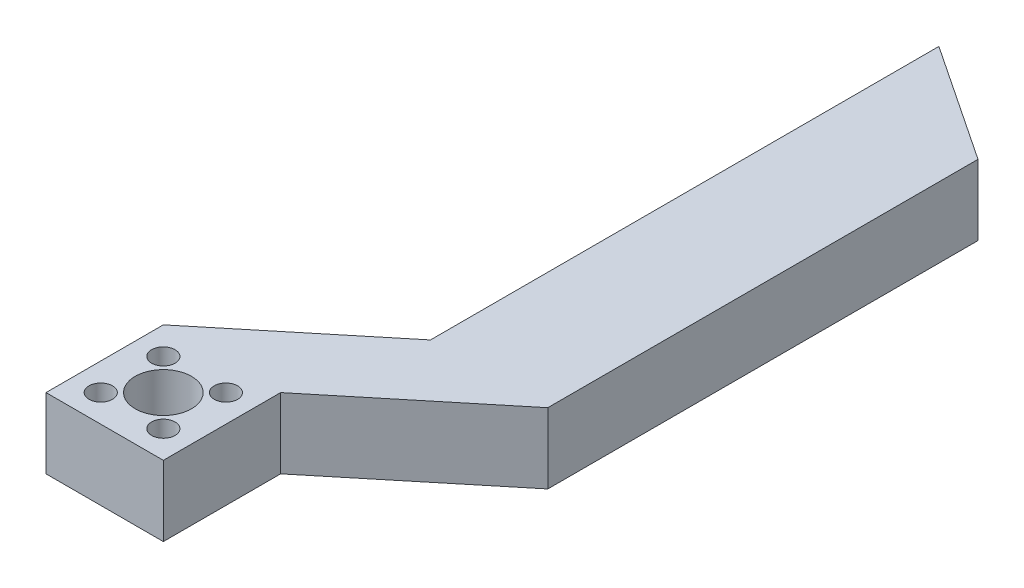
ISO-10303-21;
HEADER;
FILE_DESCRIPTION(('STEP AP214'),'2;1');
FILE_NAME('part.step','',(''),(''),'','','');
FILE_SCHEMA(('AUTOMOTIVE_DESIGN { 1 0 10303 214 1 1 1 1 }'));
ENDSEC;
DATA;
#1=APPLICATION_CONTEXT('core data for automotive mechanical design processes');
#2=APPLICATION_PROTOCOL_DEFINITION('international standard','automotive_design',2000,#1);
#3=PRODUCT_CONTEXT('',#1,'mechanical');
#4=PRODUCT('Part','Part','',(#3));
#5=PRODUCT_RELATED_PRODUCT_CATEGORY('part','',(#4));
#6=PRODUCT_DEFINITION_FORMATION('','',#4);
#7=PRODUCT_DEFINITION_CONTEXT('part definition',#1,'design');
#8=PRODUCT_DEFINITION('design','',#6,#7);
#9=PRODUCT_DEFINITION_SHAPE('','',#8);
#10=(LENGTH_UNIT() NAMED_UNIT(*) SI_UNIT(.MILLI.,.METRE.));
#11=(NAMED_UNIT(*) PLANE_ANGLE_UNIT() SI_UNIT($,.RADIAN.));
#12=(NAMED_UNIT(*) SI_UNIT($,.STERADIAN.) SOLID_ANGLE_UNIT());
#13=UNCERTAINTY_MEASURE_WITH_UNIT(LENGTH_MEASURE(1.E-05),#10,'distance_accuracy_value','');
#14=(GEOMETRIC_REPRESENTATION_CONTEXT(3) GLOBAL_UNCERTAINTY_ASSIGNED_CONTEXT((#13)) GLOBAL_UNIT_ASSIGNED_CONTEXT((#10,
#11,#12)) REPRESENTATION_CONTEXT('',''));
#15=CARTESIAN_POINT('',(0.,0.,0.));
#16=DIRECTION('',(0.,0.,1.));
#17=DIRECTION('',(1.,0.,0.));
#18=AXIS2_PLACEMENT_3D('',#15,#16,#17);
#19=CARTESIAN_POINT('',(0.,9.,0.));
#20=DIRECTION('',(0.,-1.,0.));
#21=DIRECTION('',(0.,0.,-1.));
#22=AXIS2_PLACEMENT_3D('',#19,#20,#21);
#23=PLANE('',#22);
#24=DIRECTION('',(0.772675976397421,0.,-0.634800626573645));
#25=VECTOR('',#24,1.);
#26=CARTESIAN_POINT('',(22.75,9.,-7.5));
#27=LINE('',#26,#25);
#28=CARTESIAN_POINT('',(22.75,9.,-7.5));
#29=VERTEX_POINT('',#28);
#30=CARTESIAN_POINT('',(41.5,9.,-22.9042730870849));
#31=VERTEX_POINT('',#30);
#32=EDGE_CURVE('E169',#29,#31,#27,.T.);
#33=ORIENTED_EDGE('',*,*,#32,.T.);
#34=DIRECTION('',(0.,0.,-1.));
#35=VECTOR('',#34,1.);
#36=CARTESIAN_POINT('',(41.5,9.,-77.9042730870849));
#37=LINE('',#36,#35);
#38=CARTESIAN_POINT('',(41.5,9.,-77.9042730870849));
#39=VERTEX_POINT('',#38);
#40=EDGE_CURVE('E104',#31,#39,#37,.T.);
#41=ORIENTED_EDGE('',*,*,#40,.T.);
#42=DIRECTION('',(-0.832050294337844,0.,-0.554700196225228));
#43=VECTOR('',#42,1.);
#44=CARTESIAN_POINT('',(26.5,9.,-87.9042730870849));
#45=LINE('',#44,#43);
#46=CARTESIAN_POINT('',(26.5,9.,-87.9042730870849));
#47=VERTEX_POINT('',#46);
#48=EDGE_CURVE('E190',#39,#47,#45,.T.);
#49=ORIENTED_EDGE('',*,*,#48,.T.);
#50=DIRECTION('',(0.,0.,1.));
#51=VECTOR('',#50,1.);
#52=CARTESIAN_POINT('',(26.5,9.,-77.9042730870849));
#53=LINE('',#52,#51);
#54=CARTESIAN_POINT('',(26.5,9.,-22.9042730870849));
#55=VERTEX_POINT('',#54);
#56=EDGE_CURVE('E203',#47,#55,#53,.T.);
#57=ORIENTED_EDGE('',*,*,#56,.T.);
#58=DIRECTION('',(-0.772675976397421,0.,0.634800626573645));
#59=VECTOR('',#58,1.);
#60=CARTESIAN_POINT('',(7.75,9.,-7.5));
#61=LINE('',#60,#59);
#62=CARTESIAN_POINT('',(7.75,9.,-7.5));
#63=VERTEX_POINT('',#62);
#64=EDGE_CURVE('E123',#55,#63,#61,.T.);
#65=ORIENTED_EDGE('',*,*,#64,.T.);
#66=DIRECTION('',(0.,0.,1.));
#67=VECTOR('',#66,1.);
#68=CARTESIAN_POINT('',(7.75,9.,7.5));
#69=LINE('',#68,#67);
#70=CARTESIAN_POINT('',(7.75,9.,7.5));
#71=VERTEX_POINT('',#70);
#72=EDGE_CURVE('E117',#63,#71,#69,.T.);
#73=ORIENTED_EDGE('',*,*,#72,.T.);
#74=DIRECTION('',(1.,0.,0.));
#75=VECTOR('',#74,1.);
#76=CARTESIAN_POINT('',(7.75,9.,7.5));
#77=LINE('',#76,#75);
#78=CARTESIAN_POINT('',(22.75,9.,7.5));
#79=VERTEX_POINT('',#78);
#80=EDGE_CURVE('E121',#71,#79,#77,.T.);
#81=ORIENTED_EDGE('',*,*,#80,.T.);
#82=DIRECTION('',(0.,0.,-1.));
#83=VECTOR('',#82,1.);
#84=CARTESIAN_POINT('',(22.75,9.,7.5));
#85=LINE('',#84,#83);
#86=EDGE_CURVE('E61',#79,#29,#85,.T.);
#87=ORIENTED_EDGE('',*,*,#86,.T.);
#88=EDGE_LOOP('',(#33,#41,#49,#57,#65,#73,#81,#87));
#89=FACE_BOUND('',#88,.T.);
#90=CARTESIAN_POINT('',(19.25,9.,-4.));
#91=DIRECTION('',(0.,1.,0.));
#92=DIRECTION('',(0.,0.,1.));
#93=AXIS2_PLACEMENT_3D('',#90,#91,#92);
#94=CIRCLE('',#93,1.5);
#95=CARTESIAN_POINT('',(19.25,9.,-2.5));
#96=VERTEX_POINT('',#95);
#97=EDGE_CURVE('E150',#96,#96,#94,.T.);
#98=ORIENTED_EDGE('',*,*,#97,.F.);
#99=EDGE_LOOP('',(#98));
#100=FACE_BOUND('',#99,.T.);
#101=CARTESIAN_POINT('',(19.2500000000001,9.,4.00000000000001));
#102=DIRECTION('',(0.,1.,0.));
#103=DIRECTION('',(0.,0.,1.));
#104=AXIS2_PLACEMENT_3D('',#101,#102,#103);
#105=CIRCLE('',#104,1.50000000000001);
#106=CARTESIAN_POINT('',(19.2500000000001,9.,5.50000000000001));
#107=VERTEX_POINT('',#106);
#108=EDGE_CURVE('E217',#107,#107,#105,.T.);
#109=ORIENTED_EDGE('',*,*,#108,.F.);
#110=EDGE_LOOP('',(#109));
#111=FACE_BOUND('',#110,.T.);
#112=CARTESIAN_POINT('',(11.2500000000001,9.,4.00000000000009));
#113=DIRECTION('',(0.,1.,0.));
#114=DIRECTION('',(0.,0.,1.));
#115=AXIS2_PLACEMENT_3D('',#112,#113,#114);
#116=CIRCLE('',#115,1.5);
#117=CARTESIAN_POINT('',(11.2500000000001,9.,5.50000000000009));
#118=VERTEX_POINT('',#117);
#119=EDGE_CURVE('E225',#118,#118,#116,.T.);
#120=ORIENTED_EDGE('',*,*,#119,.F.);
#121=EDGE_LOOP('',(#120));
#122=FACE_BOUND('',#121,.T.);
#123=CARTESIAN_POINT('',(11.25,9.,-3.9999999999999));
#124=DIRECTION('',(0.,1.,0.));
#125=DIRECTION('',(0.,0.,1.));
#126=AXIS2_PLACEMENT_3D('',#123,#124,#125);
#127=CIRCLE('',#126,1.50000000000002);
#128=CARTESIAN_POINT('',(11.25,9.,-2.49999999999988));
#129=VERTEX_POINT('',#128);
#130=EDGE_CURVE('E233',#129,#129,#127,.T.);
#131=ORIENTED_EDGE('',*,*,#130,.F.);
#132=EDGE_LOOP('',(#131));
#133=FACE_BOUND('',#132,.T.);
#134=CARTESIAN_POINT('',(15.25,9.,0.));
#135=DIRECTION('',(0.,1.,0.));
#136=DIRECTION('',(0.,0.,1.));
#137=AXIS2_PLACEMENT_3D('',#134,#135,#136);
#138=CIRCLE('',#137,3.6);
#139=CARTESIAN_POINT('',(15.25,9.,3.6));
#140=VERTEX_POINT('',#139);
#141=EDGE_CURVE('E241',#140,#140,#138,.T.);
#142=ORIENTED_EDGE('',*,*,#141,.F.);
#143=EDGE_LOOP('',(#142));
#144=FACE_BOUND('',#143,.T.);
#145=ADVANCED_FACE('F43',(#89,#100,#111,#122,#133,#144),#23,.F.);
#146=CARTESIAN_POINT('',(0.,0.,0.));
#147=DIRECTION('',(0.,-1.,0.));
#148=DIRECTION('',(0.,0.,-1.));
#149=AXIS2_PLACEMENT_3D('',#146,#147,#148);
#150=PLANE('',#149);
#151=CARTESIAN_POINT('',(11.25,0.,-3.9999999999999));
#152=DIRECTION('',(0.,1.,0.));
#153=DIRECTION('',(0.,0.,1.));
#154=AXIS2_PLACEMENT_3D('',#151,#152,#153);
#155=CIRCLE('',#154,1.50000000000002);
#156=CARTESIAN_POINT('',(11.25,0.,-2.49999999999988));
#157=VERTEX_POINT('',#156);
#158=EDGE_CURVE('E237',#157,#157,#155,.T.);
#159=ORIENTED_EDGE('',*,*,#158,.T.);
#160=EDGE_LOOP('',(#159));
#161=FACE_BOUND('',#160,.T.);
#162=CARTESIAN_POINT('',(19.2500000000001,0.,4.00000000000001));
#163=DIRECTION('',(0.,1.,0.));
#164=DIRECTION('',(0.,0.,1.));
#165=AXIS2_PLACEMENT_3D('',#162,#163,#164);
#166=CIRCLE('',#165,1.50000000000001);
#167=CARTESIAN_POINT('',(19.2500000000001,0.,5.50000000000001));
#168=VERTEX_POINT('',#167);
#169=EDGE_CURVE('E221',#168,#168,#166,.T.);
#170=ORIENTED_EDGE('',*,*,#169,.T.);
#171=EDGE_LOOP('',(#170));
#172=FACE_BOUND('',#171,.T.);
#173=DIRECTION('',(0.772675976397421,0.,-0.634800626573645));
#174=VECTOR('',#173,1.);
#175=CARTESIAN_POINT('',(22.75,0.,-7.5));
#176=LINE('',#175,#174);
#177=CARTESIAN_POINT('',(22.75,0.,-7.5));
#178=VERTEX_POINT('',#177);
#179=CARTESIAN_POINT('',(41.5,0.,-22.9042730870849));
#180=VERTEX_POINT('',#179);
#181=EDGE_CURVE('E145',#178,#180,#176,.T.);
#182=ORIENTED_EDGE('',*,*,#181,.F.);
#183=DIRECTION('',(0.,0.,-1.));
#184=VECTOR('',#183,1.);
#185=CARTESIAN_POINT('',(22.75,0.,7.5));
#186=LINE('',#185,#184);
#187=CARTESIAN_POINT('',(22.75,0.,7.5));
#188=VERTEX_POINT('',#187);
#189=EDGE_CURVE('E96',#188,#178,#186,.T.);
#190=ORIENTED_EDGE('',*,*,#189,.F.);
#191=DIRECTION('',(1.,0.,0.));
#192=VECTOR('',#191,1.);
#193=CARTESIAN_POINT('',(7.75,0.,7.5));
#194=LINE('',#193,#192);
#195=CARTESIAN_POINT('',(7.75,0.,7.5));
#196=VERTEX_POINT('',#195);
#197=EDGE_CURVE('E90',#196,#188,#194,.T.);
#198=ORIENTED_EDGE('',*,*,#197,.F.);
#199=DIRECTION('',(0.,0.,1.));
#200=VECTOR('',#199,1.);
#201=CARTESIAN_POINT('',(7.75,0.,7.5));
#202=LINE('',#201,#200);
#203=CARTESIAN_POINT('',(7.75,0.,-7.5));
#204=VERTEX_POINT('',#203);
#205=EDGE_CURVE('E132',#204,#196,#202,.T.);
#206=ORIENTED_EDGE('',*,*,#205,.F.);
#207=DIRECTION('',(-0.772675976397421,0.,0.634800626573645));
#208=VECTOR('',#207,1.);
#209=CARTESIAN_POINT('',(7.75,0.,-7.5));
#210=LINE('',#209,#208);
#211=CARTESIAN_POINT('',(26.5,0.,-22.9042730870849));
#212=VERTEX_POINT('',#211);
#213=EDGE_CURVE('E160',#212,#204,#210,.T.);
#214=ORIENTED_EDGE('',*,*,#213,.F.);
#215=DIRECTION('',(0.,0.,1.));
#216=VECTOR('',#215,1.);
#217=CARTESIAN_POINT('',(26.5,0.,-77.9042730870849));
#218=LINE('',#217,#216);
#219=CARTESIAN_POINT('',(26.5,0.,-87.9042730870849));
#220=VERTEX_POINT('',#219);
#221=EDGE_CURVE('E157',#220,#212,#218,.T.);
#222=ORIENTED_EDGE('',*,*,#221,.F.);
#223=DIRECTION('',(-0.832050294337844,0.,-0.554700196225228));
#224=VECTOR('',#223,1.);
#225=CARTESIAN_POINT('',(26.5,0.,-87.9042730870849));
#226=LINE('',#225,#224);
#227=CARTESIAN_POINT('',(41.5,0.,-77.9042730870849));
#228=VERTEX_POINT('',#227);
#229=EDGE_CURVE('E153',#228,#220,#226,.T.);
#230=ORIENTED_EDGE('',*,*,#229,.F.);
#231=DIRECTION('',(0.,0.,-1.));
#232=VECTOR('',#231,1.);
#233=CARTESIAN_POINT('',(41.5,0.,-77.9042730870849));
#234=LINE('',#233,#232);
#235=EDGE_CURVE('E149',#180,#228,#234,.T.);
#236=ORIENTED_EDGE('',*,*,#235,.F.);
#237=EDGE_LOOP('',(#182,#190,#198,#206,#214,#222,#230,#236));
#238=FACE_BOUND('',#237,.T.);
#239=CARTESIAN_POINT('',(19.25,0.,-4.));
#240=DIRECTION('',(0.,1.,0.));
#241=DIRECTION('',(0.,0.,1.));
#242=AXIS2_PLACEMENT_3D('',#239,#240,#241);
#243=CIRCLE('',#242,1.5);
#244=CARTESIAN_POINT('',(19.25,0.,-2.5));
#245=VERTEX_POINT('',#244);
#246=EDGE_CURVE('E213',#245,#245,#243,.T.);
#247=ORIENTED_EDGE('',*,*,#246,.T.);
#248=EDGE_LOOP('',(#247));
#249=FACE_BOUND('',#248,.T.);
#250=CARTESIAN_POINT('',(11.2500000000001,0.,4.00000000000009));
#251=DIRECTION('',(0.,1.,0.));
#252=DIRECTION('',(0.,0.,1.));
#253=AXIS2_PLACEMENT_3D('',#250,#251,#252);
#254=CIRCLE('',#253,1.5);
#255=CARTESIAN_POINT('',(11.2500000000001,0.,5.50000000000009));
#256=VERTEX_POINT('',#255);
#257=EDGE_CURVE('E229',#256,#256,#254,.T.);
#258=ORIENTED_EDGE('',*,*,#257,.T.);
#259=EDGE_LOOP('',(#258));
#260=FACE_BOUND('',#259,.T.);
#261=CARTESIAN_POINT('',(15.25,0.,0.));
#262=DIRECTION('',(0.,1.,0.));
#263=DIRECTION('',(0.,0.,1.));
#264=AXIS2_PLACEMENT_3D('',#261,#262,#263);
#265=CIRCLE('',#264,3.6);
#266=CARTESIAN_POINT('',(15.25,0.,3.6));
#267=VERTEX_POINT('',#266);
#268=EDGE_CURVE('E245',#267,#267,#265,.T.);
#269=ORIENTED_EDGE('',*,*,#268,.T.);
#270=EDGE_LOOP('',(#269));
#271=FACE_BOUND('',#270,.T.);
#272=ADVANCED_FACE('F193',(#161,#172,#238,#249,#260,#271),#150,.T.);
#273=CARTESIAN_POINT('',(22.75,9.,-7.5));
#274=DIRECTION('',(-0.634800626573645,0.,-0.772675976397421));
#275=DIRECTION('',(-0.772675976397421,0.,0.634800626573645));
#276=AXIS2_PLACEMENT_3D('',#273,#274,#275);
#277=PLANE('',#276);
#278=ORIENTED_EDGE('',*,*,#181,.T.);
#279=DIRECTION('',(0.,-1.,0.));
#280=VECTOR('',#279,1.);
#281=CARTESIAN_POINT('',(41.5,9.,-22.9042730870849));
#282=LINE('',#281,#280);
#283=EDGE_CURVE('E11',#31,#180,#282,.T.);
#284=ORIENTED_EDGE('',*,*,#283,.F.);
#285=ORIENTED_EDGE('',*,*,#32,.F.);
#286=DIRECTION('',(0.,-1.,0.));
#287=VECTOR('',#286,1.);
#288=CARTESIAN_POINT('',(22.75,9.,-7.5));
#289=LINE('',#288,#287);
#290=EDGE_CURVE('E141',#29,#178,#289,.T.);
#291=ORIENTED_EDGE('',*,*,#290,.T.);
#292=EDGE_LOOP('',(#278,#284,#285,#291));
#293=FACE_BOUND('',#292,.T.);
#294=ADVANCED_FACE('F45',(#293),#277,.F.);
#295=CARTESIAN_POINT('',(41.5,9.,-77.9042730870849));
#296=DIRECTION('',(-1.,0.,0.));
#297=DIRECTION('',(0.,0.,1.));
#298=AXIS2_PLACEMENT_3D('',#295,#296,#297);
#299=PLANE('',#298);
#300=ORIENTED_EDGE('',*,*,#235,.T.);
#301=DIRECTION('',(0.,-1.,0.));
#302=VECTOR('',#301,1.);
#303=CARTESIAN_POINT('',(41.5,9.,-77.9042730870849));
#304=LINE('',#303,#302);
#305=EDGE_CURVE('E53',#39,#228,#304,.T.);
#306=ORIENTED_EDGE('',*,*,#305,.F.);
#307=ORIENTED_EDGE('',*,*,#40,.F.);
#308=ORIENTED_EDGE('',*,*,#283,.T.);
#309=EDGE_LOOP('',(#300,#306,#307,#308));
#310=FACE_BOUND('',#309,.T.);
#311=ADVANCED_FACE('F279',(#310),#299,.F.);
#312=CARTESIAN_POINT('',(26.5,9.,-87.9042730870849));
#313=DIRECTION('',(-0.554700196225228,0.,0.832050294337844));
#314=DIRECTION('',(0.832050294337844,0.,0.554700196225228));
#315=AXIS2_PLACEMENT_3D('',#312,#313,#314);
#316=PLANE('',#315);
#317=ORIENTED_EDGE('',*,*,#229,.T.);
#318=DIRECTION('',(0.,-1.,0.));
#319=VECTOR('',#318,1.);
#320=CARTESIAN_POINT('',(26.5,9.,-87.9042730870849));
#321=LINE('',#320,#319);
#322=EDGE_CURVE('E180',#47,#220,#321,.T.);
#323=ORIENTED_EDGE('',*,*,#322,.F.);
#324=ORIENTED_EDGE('',*,*,#48,.F.);
#325=ORIENTED_EDGE('',*,*,#305,.T.);
#326=EDGE_LOOP('',(#317,#323,#324,#325));
#327=FACE_BOUND('',#326,.T.);
#328=ADVANCED_FACE('F188',(#327),#316,.F.);
#329=CARTESIAN_POINT('',(26.5,9.,-77.9042730870849));
#330=DIRECTION('',(1.,0.,0.));
#331=DIRECTION('',(0.,0.,-1.));
#332=AXIS2_PLACEMENT_3D('',#329,#330,#331);
#333=PLANE('',#332);
#334=ORIENTED_EDGE('',*,*,#221,.T.);
#335=DIRECTION('',(0.,-1.,0.));
#336=VECTOR('',#335,1.);
#337=CARTESIAN_POINT('',(26.5,9.,-22.9042730870849));
#338=LINE('',#337,#336);
#339=EDGE_CURVE('E176',#55,#212,#338,.T.);
#340=ORIENTED_EDGE('',*,*,#339,.F.);
#341=ORIENTED_EDGE('',*,*,#56,.F.);
#342=ORIENTED_EDGE('',*,*,#322,.T.);
#343=EDGE_LOOP('',(#334,#340,#341,#342));
#344=FACE_BOUND('',#343,.T.);
#345=ADVANCED_FACE('F198',(#344),#333,.F.);
#346=CARTESIAN_POINT('',(7.75,9.,-7.5));
#347=DIRECTION('',(0.634800626573645,0.,0.772675976397421));
#348=DIRECTION('',(0.772675976397421,0.,-0.634800626573645));
#349=AXIS2_PLACEMENT_3D('',#346,#347,#348);
#350=PLANE('',#349);
#351=ORIENTED_EDGE('',*,*,#213,.T.);
#352=DIRECTION('',(0.,-1.,0.));
#353=VECTOR('',#352,1.);
#354=CARTESIAN_POINT('',(7.75,9.,-7.5));
#355=LINE('',#354,#353);
#356=EDGE_CURVE('E134',#63,#204,#355,.T.);
#357=ORIENTED_EDGE('',*,*,#356,.F.);
#358=ORIENTED_EDGE('',*,*,#64,.F.);
#359=ORIENTED_EDGE('',*,*,#339,.T.);
#360=EDGE_LOOP('',(#351,#357,#358,#359));
#361=FACE_BOUND('',#360,.T.);
#362=ADVANCED_FACE('F201',(#361),#350,.F.);
#363=CARTESIAN_POINT('',(7.75,9.,7.5));
#364=DIRECTION('',(1.,0.,0.));
#365=DIRECTION('',(0.,0.,-1.));
#366=AXIS2_PLACEMENT_3D('',#363,#364,#365);
#367=PLANE('',#366);
#368=ORIENTED_EDGE('',*,*,#205,.T.);
#369=DIRECTION('',(0.,-1.,0.));
#370=VECTOR('',#369,1.);
#371=CARTESIAN_POINT('',(7.75,9.,7.5));
#372=LINE('',#371,#370);
#373=EDGE_CURVE('E129',#71,#196,#372,.T.);
#374=ORIENTED_EDGE('',*,*,#373,.F.);
#375=ORIENTED_EDGE('',*,*,#72,.F.);
#376=ORIENTED_EDGE('',*,*,#356,.T.);
#377=EDGE_LOOP('',(#368,#374,#375,#376));
#378=FACE_BOUND('',#377,.T.);
#379=ADVANCED_FACE('F130',(#378),#367,.F.);
#380=CARTESIAN_POINT('',(7.75,9.,7.5));
#381=DIRECTION('',(0.,0.,-1.));
#382=DIRECTION('',(-1.,0.,0.));
#383=AXIS2_PLACEMENT_3D('',#380,#381,#382);
#384=PLANE('',#383);
#385=ORIENTED_EDGE('',*,*,#197,.T.);
#386=DIRECTION('',(0.,-1.,0.));
#387=VECTOR('',#386,1.);
#388=CARTESIAN_POINT('',(22.75,9.,7.5));
#389=LINE('',#388,#387);
#390=EDGE_CURVE('E135',#79,#188,#389,.T.);
#391=ORIENTED_EDGE('',*,*,#390,.F.);
#392=ORIENTED_EDGE('',*,*,#80,.F.);
#393=ORIENTED_EDGE('',*,*,#373,.T.);
#394=EDGE_LOOP('',(#385,#391,#392,#393));
#395=FACE_BOUND('',#394,.T.);
#396=ADVANCED_FACE('F137',(#395),#384,.F.);
#397=CARTESIAN_POINT('',(22.75,9.,7.5));
#398=DIRECTION('',(-1.,0.,0.));
#399=DIRECTION('',(0.,0.,1.));
#400=AXIS2_PLACEMENT_3D('',#397,#398,#399);
#401=PLANE('',#400);
#402=ORIENTED_EDGE('',*,*,#189,.T.);
#403=ORIENTED_EDGE('',*,*,#290,.F.);
#404=ORIENTED_EDGE('',*,*,#86,.F.);
#405=ORIENTED_EDGE('',*,*,#390,.T.);
#406=EDGE_LOOP('',(#402,#403,#404,#405));
#407=FACE_BOUND('',#406,.T.);
#408=ADVANCED_FACE('F267',(#407),#401,.F.);
#409=CARTESIAN_POINT('',(19.25,9.,-4.));
#410=DIRECTION('',(0.,-1.,0.));
#411=DIRECTION('',(0.,0.,-1.));
#412=AXIS2_PLACEMENT_3D('',#409,#410,#411);
#413=CYLINDRICAL_SURFACE('',#412,1.5);
#414=ORIENTED_EDGE('',*,*,#97,.T.);
#415=EDGE_LOOP('',(#414));
#416=FACE_BOUND('',#415,.T.);
#417=ORIENTED_EDGE('',*,*,#246,.F.);
#418=EDGE_LOOP('',(#417));
#419=FACE_BOUND('',#418,.T.);
#420=ADVANCED_FACE('F264',(#416,#419),#413,.F.);
#421=CARTESIAN_POINT('',(19.2500000000001,9.,4.00000000000001));
#422=DIRECTION('',(0.,-1.,0.));
#423=DIRECTION('',(0.,0.,-1.));
#424=AXIS2_PLACEMENT_3D('',#421,#422,#423);
#425=CYLINDRICAL_SURFACE('',#424,1.50000000000001);
#426=ORIENTED_EDGE('',*,*,#108,.T.);
#427=EDGE_LOOP('',(#426));
#428=FACE_BOUND('',#427,.T.);
#429=ORIENTED_EDGE('',*,*,#169,.F.);
#430=EDGE_LOOP('',(#429));
#431=FACE_BOUND('',#430,.T.);
#432=ADVANCED_FACE('F355',(#428,#431),#425,.F.);
#433=CARTESIAN_POINT('',(11.2500000000001,9.,4.00000000000009));
#434=DIRECTION('',(0.,-1.,0.));
#435=DIRECTION('',(0.,0.,-1.));
#436=AXIS2_PLACEMENT_3D('',#433,#434,#435);
#437=CYLINDRICAL_SURFACE('',#436,1.5);
#438=ORIENTED_EDGE('',*,*,#119,.T.);
#439=EDGE_LOOP('',(#438));
#440=FACE_BOUND('',#439,.T.);
#441=ORIENTED_EDGE('',*,*,#257,.F.);
#442=EDGE_LOOP('',(#441));
#443=FACE_BOUND('',#442,.T.);
#444=ADVANCED_FACE('F364',(#440,#443),#437,.F.);
#445=CARTESIAN_POINT('',(11.25,9.,-3.9999999999999));
#446=DIRECTION('',(0.,-1.,0.));
#447=DIRECTION('',(0.,0.,-1.));
#448=AXIS2_PLACEMENT_3D('',#445,#446,#447);
#449=CYLINDRICAL_SURFACE('',#448,1.50000000000002);
#450=ORIENTED_EDGE('',*,*,#130,.T.);
#451=EDGE_LOOP('',(#450));
#452=FACE_BOUND('',#451,.T.);
#453=ORIENTED_EDGE('',*,*,#158,.F.);
#454=EDGE_LOOP('',(#453));
#455=FACE_BOUND('',#454,.T.);
#456=ADVANCED_FACE('F373',(#452,#455),#449,.F.);
#457=CARTESIAN_POINT('',(15.25,9.,0.));
#458=DIRECTION('',(0.,-1.,0.));
#459=DIRECTION('',(0.,0.,-1.));
#460=AXIS2_PLACEMENT_3D('',#457,#458,#459);
#461=CYLINDRICAL_SURFACE('',#460,3.6);
#462=ORIENTED_EDGE('',*,*,#141,.T.);
#463=EDGE_LOOP('',(#462));
#464=FACE_BOUND('',#463,.T.);
#465=ORIENTED_EDGE('',*,*,#268,.F.);
#466=EDGE_LOOP('',(#465));
#467=FACE_BOUND('',#466,.T.);
#468=ADVANCED_FACE('F253',(#464,#467),#461,.F.);
#469=CLOSED_SHELL('',(#145,#272,#294,#311,#328,#345,#362,#379,#396,#408,#420,#432,#444,#456,#468));
#470=MANIFOLD_SOLID_BREP('B2',#469);
#471=ADVANCED_BREP_SHAPE_REPRESENTATION('',(#18,#470),#14);
#472=SHAPE_DEFINITION_REPRESENTATION(#9,#471);
ENDSEC;
END-ISO-10303-21;
